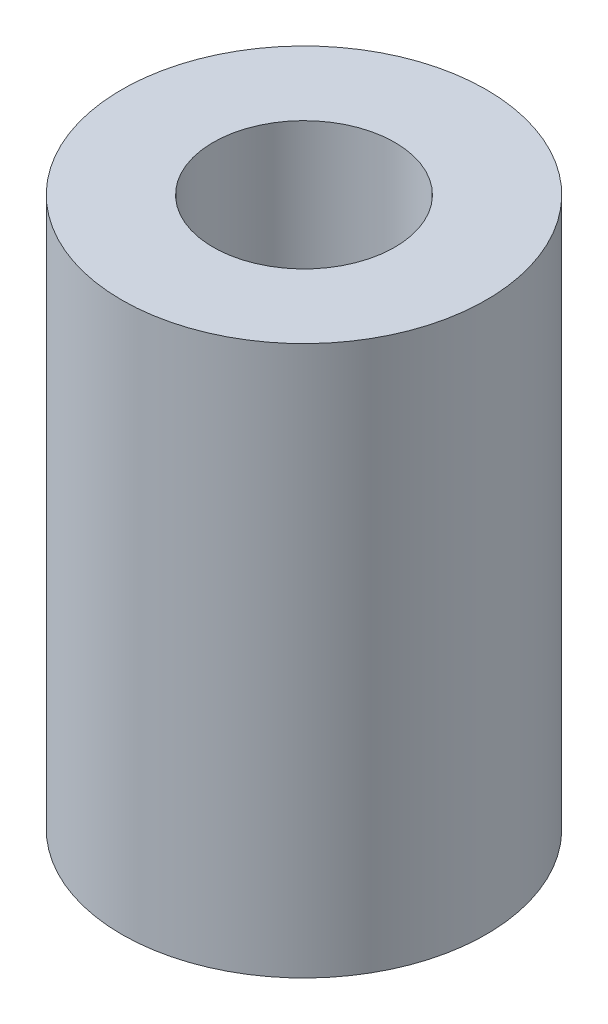
ISO-10303-21;
HEADER;
FILE_DESCRIPTION(('STEP AP214'),'2;1');
FILE_NAME('part.step','',(''),(''),'','','');
FILE_SCHEMA(('AUTOMOTIVE_DESIGN { 1 0 10303 214 1 1 1 1 }'));
ENDSEC;
DATA;
#1=APPLICATION_CONTEXT('core data for automotive mechanical design processes');
#2=APPLICATION_PROTOCOL_DEFINITION('international standard','automotive_design',2000,#1);
#3=PRODUCT_CONTEXT('',#1,'mechanical');
#4=PRODUCT('Part','Part','',(#3));
#5=PRODUCT_RELATED_PRODUCT_CATEGORY('part','',(#4));
#6=PRODUCT_DEFINITION_FORMATION('','',#4);
#7=PRODUCT_DEFINITION_CONTEXT('part definition',#1,'design');
#8=PRODUCT_DEFINITION('design','',#6,#7);
#9=PRODUCT_DEFINITION_SHAPE('','',#8);
#10=(LENGTH_UNIT() NAMED_UNIT(*) SI_UNIT(.MILLI.,.METRE.));
#11=(NAMED_UNIT(*) PLANE_ANGLE_UNIT() SI_UNIT($,.RADIAN.));
#12=(NAMED_UNIT(*) SI_UNIT($,.STERADIAN.) SOLID_ANGLE_UNIT());
#13=UNCERTAINTY_MEASURE_WITH_UNIT(LENGTH_MEASURE(1.E-05),#10,'distance_accuracy_value','');
#14=(GEOMETRIC_REPRESENTATION_CONTEXT(3) GLOBAL_UNCERTAINTY_ASSIGNED_CONTEXT((#13)) GLOBAL_UNIT_ASSIGNED_CONTEXT((#10,
#11,#12)) REPRESENTATION_CONTEXT('',''));
#15=CARTESIAN_POINT('',(0.,0.,0.));
#16=DIRECTION('',(0.,0.,1.));
#17=DIRECTION('',(1.,0.,0.));
#18=AXIS2_PLACEMENT_3D('',#15,#16,#17);
#19=CARTESIAN_POINT('',(0.,19.05,0.));
#20=DIRECTION('',(0.,-1.,0.));
#21=DIRECTION('',(0.,0.,-1.));
#22=AXIS2_PLACEMENT_3D('',#19,#20,#21);
#23=CYLINDRICAL_SURFACE('',#22,3.15);
#24=CARTESIAN_POINT('',(0.,19.05,0.));
#25=DIRECTION('',(0.,1.,0.));
#26=DIRECTION('',(0.,0.,1.));
#27=AXIS2_PLACEMENT_3D('',#24,#25,#26);
#28=CIRCLE('',#27,3.15);
#29=CARTESIAN_POINT('',(0.,19.05,-3.15));
#30=VERTEX_POINT('',#29);
#31=EDGE_CURVE('E38',#30,#30,#28,.T.);
#32=CARTESIAN_POINT('',(0.,0.,0.));
#33=DIRECTION('',(0.,1.,0.));
#34=DIRECTION('',(0.,0.,1.));
#35=AXIS2_PLACEMENT_3D('',#32,#33,#34);
#36=CIRCLE('',#35,3.15);
#37=CARTESIAN_POINT('',(0.,0.,-3.15));
#38=VERTEX_POINT('',#37);
#39=EDGE_CURVE('E44',#38,#38,#36,.T.);
#40=CARTESIAN_POINT('',(0.,19.05,-3.15));
#41=CARTESIAN_POINT('',(0.,18.8515625,-3.15));
#42=CARTESIAN_POINT('',(0.,18.653125,-3.15));
#43=CARTESIAN_POINT('',(0.,18.25625,-3.15));
#44=CARTESIAN_POINT('',(0.,18.0578125,-3.15));
#45=CARTESIAN_POINT('',(0.,17.6609375,-3.15));
#46=CARTESIAN_POINT('',(0.,17.4625,-3.15));
#47=CARTESIAN_POINT('',(0.,17.065625,-3.15));
#48=CARTESIAN_POINT('',(0.,16.8671875,-3.15));
#49=CARTESIAN_POINT('',(0.,16.4703125,-3.15));
#50=CARTESIAN_POINT('',(0.,16.271875,-3.15));
#51=CARTESIAN_POINT('',(0.,15.875,-3.15));
#52=CARTESIAN_POINT('',(0.,15.6765625,-3.15));
#53=CARTESIAN_POINT('',(0.,15.2796875,-3.15));
#54=CARTESIAN_POINT('',(0.,15.08125,-3.15));
#55=CARTESIAN_POINT('',(0.,14.684375,-3.15));
#56=CARTESIAN_POINT('',(0.,14.4859375,-3.15));
#57=CARTESIAN_POINT('',(0.,14.0890625,-3.15));
#58=CARTESIAN_POINT('',(0.,13.890625,-3.15));
#59=CARTESIAN_POINT('',(0.,13.49375,-3.15));
#60=CARTESIAN_POINT('',(0.,13.2953125,-3.15));
#61=CARTESIAN_POINT('',(0.,12.8984375,-3.15));
#62=CARTESIAN_POINT('',(0.,12.7,-3.15));
#63=CARTESIAN_POINT('',(0.,12.303125,-3.15));
#64=CARTESIAN_POINT('',(0.,12.1046875,-3.15));
#65=CARTESIAN_POINT('',(0.,11.7078125,-3.15));
#66=CARTESIAN_POINT('',(0.,11.509375,-3.15));
#67=CARTESIAN_POINT('',(0.,11.1125,-3.15));
#68=CARTESIAN_POINT('',(0.,10.9140625,-3.15));
#69=CARTESIAN_POINT('',(0.,10.5171875,-3.15));
#70=CARTESIAN_POINT('',(0.,10.31875,-3.15));
#71=CARTESIAN_POINT('',(0.,9.921875,-3.15));
#72=CARTESIAN_POINT('',(0.,9.7234375,-3.15));
#73=CARTESIAN_POINT('',(0.,9.3265625,-3.15));
#74=CARTESIAN_POINT('',(0.,9.128125,-3.15));
#75=CARTESIAN_POINT('',(0.,8.73125,-3.15));
#76=CARTESIAN_POINT('',(0.,8.5328125,-3.15));
#77=CARTESIAN_POINT('',(0.,8.1359375,-3.15));
#78=CARTESIAN_POINT('',(0.,7.9375,-3.15));
#79=CARTESIAN_POINT('',(0.,7.540625,-3.15));
#80=CARTESIAN_POINT('',(0.,7.3421875,-3.15));
#81=CARTESIAN_POINT('',(0.,6.9453125,-3.15));
#82=CARTESIAN_POINT('',(0.,6.746875,-3.15));
#83=CARTESIAN_POINT('',(0.,6.35,-3.15));
#84=CARTESIAN_POINT('',(0.,6.1515625,-3.15));
#85=CARTESIAN_POINT('',(0.,5.7546875,-3.15));
#86=CARTESIAN_POINT('',(0.,5.55625,-3.15));
#87=CARTESIAN_POINT('',(0.,5.159375,-3.15));
#88=CARTESIAN_POINT('',(0.,4.9609375,-3.15));
#89=CARTESIAN_POINT('',(0.,4.5640625,-3.15));
#90=CARTESIAN_POINT('',(0.,4.365625,-3.15));
#91=CARTESIAN_POINT('',(0.,3.96875,-3.15));
#92=CARTESIAN_POINT('',(0.,3.7703125,-3.15));
#93=CARTESIAN_POINT('',(0.,3.3734375,-3.15));
#94=CARTESIAN_POINT('',(0.,3.175,-3.15));
#95=CARTESIAN_POINT('',(0.,2.778125,-3.15));
#96=CARTESIAN_POINT('',(0.,2.5796875,-3.15));
#97=CARTESIAN_POINT('',(0.,2.1828125,-3.15));
#98=CARTESIAN_POINT('',(0.,1.984375,-3.15));
#99=CARTESIAN_POINT('',(0.,1.5875,-3.15));
#100=CARTESIAN_POINT('',(0.,1.3890625,-3.15));
#101=CARTESIAN_POINT('',(0.,0.992187500000001,-3.15));
#102=CARTESIAN_POINT('',(0.,0.793750000000001,-3.15));
#103=CARTESIAN_POINT('',(0.,0.396875,-3.15));
#104=CARTESIAN_POINT('',(0.,0.1984375,-3.15));
#105=CARTESIAN_POINT('',(0.,0.,-3.15));
#106=B_SPLINE_CURVE_WITH_KNOTS('',3,(#40,#41,#42,#43,#44,#45,#46,#47,#48,#49,#50,#51,#52,#53,
#54,#55,#56,#57,#58,#59,#60,#61,#62,#63,#64,#65,#66,#67,#68,#69,#70,#71,#72,#73,#74,#75,#76,#77,
#78,#79,#80,#81,#82,#83,#84,#85,#86,#87,#88,#89,#90,#91,#92,#93,#94,#95,#96,#97,#98,#99,#100,
#101,#102,#103,#104,#105),.UNSPECIFIED.,.F.,.F.,(4,2,2,2,2,2,2,2,2,2,2,2,2,2,2,2,2,2,2,2,2,2,2,
2,2,2,2,2,2,2,2,2,4),(0.,0.5953125,1.190625,1.7859375,2.38125,2.9765625,3.571875,4.1671875,
4.7625,5.3578125,5.953125,6.5484375,7.14375,7.7390625,8.334375,8.9296875,9.525,10.1203125,
10.715625,11.3109375,11.90625,12.5015625,13.096875,13.6921875,14.2875,14.8828125,15.478125,
16.0734375,16.66875,17.2640625,17.859375,18.4546875,19.05),.UNSPECIFIED.);
#107=EDGE_CURVE('BSEAM31',#30,#38,#106,.T.);
#108=ORIENTED_EDGE('',*,*,#31,.T.);
#109=ORIENTED_EDGE('',*,*,#39,.F.);
#110=ORIENTED_EDGE('',*,*,#107,.T.);
#111=ORIENTED_EDGE('',*,*,#107,.F.);
#112=EDGE_LOOP('',(#108,#110,#109,#111));
#113=FACE_BOUND('',#112,.T.);
#114=ADVANCED_FACE('F31',(#113),#23,.F.);
#115=CARTESIAN_POINT('',(0.,19.05,0.));
#116=DIRECTION('',(0.,-1.,0.));
#117=DIRECTION('',(0.,0.,-1.));
#118=AXIS2_PLACEMENT_3D('',#115,#116,#117);
#119=CYLINDRICAL_SURFACE('',#118,6.32);
#120=CARTESIAN_POINT('',(0.,19.05,0.));
#121=DIRECTION('',(0.,1.,0.));
#122=DIRECTION('',(0.,0.,1.));
#123=AXIS2_PLACEMENT_3D('',#120,#121,#122);
#124=CIRCLE('',#123,6.32);
#125=CARTESIAN_POINT('',(0.,19.05,-6.32));
#126=VERTEX_POINT('',#125);
#127=EDGE_CURVE('E10',#126,#126,#124,.T.);
#128=CARTESIAN_POINT('',(0.,0.,0.));
#129=DIRECTION('',(0.,1.,0.));
#130=DIRECTION('',(0.,0.,1.));
#131=AXIS2_PLACEMENT_3D('',#128,#129,#130);
#132=CIRCLE('',#131,6.32);
#133=CARTESIAN_POINT('',(0.,0.,-6.32));
#134=VERTEX_POINT('',#133);
#135=EDGE_CURVE('E34',#134,#134,#132,.T.);
#136=CARTESIAN_POINT('',(0.,19.05,-6.32));
#137=CARTESIAN_POINT('',(0.,18.8515625,-6.32));
#138=CARTESIAN_POINT('',(0.,18.653125,-6.32));
#139=CARTESIAN_POINT('',(0.,18.25625,-6.32));
#140=CARTESIAN_POINT('',(0.,18.0578125,-6.32));
#141=CARTESIAN_POINT('',(0.,17.6609375,-6.32));
#142=CARTESIAN_POINT('',(0.,17.4625,-6.32));
#143=CARTESIAN_POINT('',(0.,17.065625,-6.32));
#144=CARTESIAN_POINT('',(0.,16.8671875,-6.32));
#145=CARTESIAN_POINT('',(0.,16.4703125,-6.32));
#146=CARTESIAN_POINT('',(0.,16.271875,-6.32));
#147=CARTESIAN_POINT('',(0.,15.875,-6.32));
#148=CARTESIAN_POINT('',(0.,15.6765625,-6.32));
#149=CARTESIAN_POINT('',(0.,15.2796875,-6.32));
#150=CARTESIAN_POINT('',(0.,15.08125,-6.32));
#151=CARTESIAN_POINT('',(0.,14.684375,-6.32));
#152=CARTESIAN_POINT('',(0.,14.4859375,-6.32));
#153=CARTESIAN_POINT('',(0.,14.0890625,-6.32));
#154=CARTESIAN_POINT('',(0.,13.890625,-6.32));
#155=CARTESIAN_POINT('',(0.,13.49375,-6.32));
#156=CARTESIAN_POINT('',(0.,13.2953125,-6.32));
#157=CARTESIAN_POINT('',(0.,12.8984375,-6.32));
#158=CARTESIAN_POINT('',(0.,12.7,-6.32));
#159=CARTESIAN_POINT('',(0.,12.303125,-6.32));
#160=CARTESIAN_POINT('',(0.,12.1046875,-6.32));
#161=CARTESIAN_POINT('',(0.,11.7078125,-6.32));
#162=CARTESIAN_POINT('',(0.,11.509375,-6.32));
#163=CARTESIAN_POINT('',(0.,11.1125,-6.32));
#164=CARTESIAN_POINT('',(0.,10.9140625,-6.32));
#165=CARTESIAN_POINT('',(0.,10.5171875,-6.32));
#166=CARTESIAN_POINT('',(0.,10.31875,-6.32));
#167=CARTESIAN_POINT('',(0.,9.921875,-6.32));
#168=CARTESIAN_POINT('',(0.,9.7234375,-6.32));
#169=CARTESIAN_POINT('',(0.,9.3265625,-6.32));
#170=CARTESIAN_POINT('',(0.,9.128125,-6.32));
#171=CARTESIAN_POINT('',(0.,8.73125,-6.32));
#172=CARTESIAN_POINT('',(0.,8.5328125,-6.32));
#173=CARTESIAN_POINT('',(0.,8.1359375,-6.32));
#174=CARTESIAN_POINT('',(0.,7.9375,-6.32));
#175=CARTESIAN_POINT('',(0.,7.540625,-6.32));
#176=CARTESIAN_POINT('',(0.,7.3421875,-6.32));
#177=CARTESIAN_POINT('',(0.,6.9453125,-6.32));
#178=CARTESIAN_POINT('',(0.,6.746875,-6.32));
#179=CARTESIAN_POINT('',(0.,6.35,-6.32));
#180=CARTESIAN_POINT('',(0.,6.1515625,-6.32));
#181=CARTESIAN_POINT('',(0.,5.7546875,-6.32));
#182=CARTESIAN_POINT('',(0.,5.55625,-6.32));
#183=CARTESIAN_POINT('',(0.,5.159375,-6.32));
#184=CARTESIAN_POINT('',(0.,4.9609375,-6.32));
#185=CARTESIAN_POINT('',(0.,4.5640625,-6.32));
#186=CARTESIAN_POINT('',(0.,4.365625,-6.32));
#187=CARTESIAN_POINT('',(0.,3.96875,-6.32));
#188=CARTESIAN_POINT('',(0.,3.7703125,-6.32));
#189=CARTESIAN_POINT('',(0.,3.3734375,-6.32));
#190=CARTESIAN_POINT('',(0.,3.175,-6.32));
#191=CARTESIAN_POINT('',(0.,2.778125,-6.32));
#192=CARTESIAN_POINT('',(0.,2.5796875,-6.32));
#193=CARTESIAN_POINT('',(0.,2.1828125,-6.32));
#194=CARTESIAN_POINT('',(0.,1.984375,-6.32));
#195=CARTESIAN_POINT('',(0.,1.5875,-6.32));
#196=CARTESIAN_POINT('',(0.,1.3890625,-6.32));
#197=CARTESIAN_POINT('',(0.,0.992187500000001,-6.32));
#198=CARTESIAN_POINT('',(0.,0.793750000000001,-6.32));
#199=CARTESIAN_POINT('',(0.,0.396875,-6.32));
#200=CARTESIAN_POINT('',(0.,0.1984375,-6.32));
#201=CARTESIAN_POINT('',(0.,0.,-6.32));
#202=B_SPLINE_CURVE_WITH_KNOTS('',3,(#136,#137,#138,#139,#140,#141,#142,#143,#144,#145,#146,
#147,#148,#149,#150,#151,#152,#153,#154,#155,#156,#157,#158,#159,#160,#161,#162,#163,#164,#165,
#166,#167,#168,#169,#170,#171,#172,#173,#174,#175,#176,#177,#178,#179,#180,#181,#182,#183,#184,
#185,#186,#187,#188,#189,#190,#191,#192,#193,#194,#195,#196,#197,#198,#199,#200,#201),
.UNSPECIFIED.,.F.,.F.,(4,2,2,2,2,2,2,2,2,2,2,2,2,2,2,2,2,2,2,2,2,2,2,2,2,2,2,2,2,2,2,2,4),(0.,
0.595312499999997,1.190625,1.7859375,2.38125,2.9765625,3.571875,4.1671875,4.7625,5.3578125,
5.953125,6.5484375,7.14375,7.7390625,8.334375,8.9296875,9.525,10.1203125,10.715625,11.3109375,
11.90625,12.5015625,13.096875,13.6921875,14.2875,14.8828125,15.478125,16.0734375,16.66875,
17.2640625,17.859375,18.4546875,19.05),.UNSPECIFIED.);
#203=EDGE_CURVE('BSEAM51',#126,#134,#202,.T.);
#204=ORIENTED_EDGE('',*,*,#127,.F.);
#205=ORIENTED_EDGE('',*,*,#135,.T.);
#206=ORIENTED_EDGE('',*,*,#203,.T.);
#207=ORIENTED_EDGE('',*,*,#203,.F.);
#208=EDGE_LOOP('',(#204,#206,#205,#207));
#209=FACE_BOUND('',#208,.T.);
#210=ADVANCED_FACE('F51',(#209),#119,.T.);
#211=CARTESIAN_POINT('',(0.,19.05,0.));
#212=DIRECTION('',(0.,1.,0.));
#213=DIRECTION('',(0.,0.,1.));
#214=AXIS2_PLACEMENT_3D('',#211,#212,#213);
#215=PLANE('',#214);
#216=ORIENTED_EDGE('',*,*,#31,.F.);
#217=EDGE_LOOP('',(#216));
#218=FACE_BOUND('',#217,.T.);
#219=ORIENTED_EDGE('',*,*,#127,.T.);
#220=EDGE_LOOP('',(#219));
#221=FACE_BOUND('',#220,.T.);
#222=ADVANCED_FACE('F55',(#218,#221),#215,.T.);
#223=CARTESIAN_POINT('',(0.,0.,0.));
#224=DIRECTION('',(0.,1.,0.));
#225=DIRECTION('',(0.,0.,1.));
#226=AXIS2_PLACEMENT_3D('',#223,#224,#225);
#227=PLANE('',#226);
#228=ORIENTED_EDGE('',*,*,#39,.T.);
#229=EDGE_LOOP('',(#228));
#230=FACE_BOUND('',#229,.T.);
#231=ORIENTED_EDGE('',*,*,#135,.F.);
#232=EDGE_LOOP('',(#231));
#233=FACE_BOUND('',#232,.T.);
#234=ADVANCED_FACE('F53',(#230,#233),#227,.F.);
#235=CLOSED_SHELL('',(#114,#210,#222,#234));
#236=MANIFOLD_SOLID_BREP('B2',#235);
#237=ADVANCED_BREP_SHAPE_REPRESENTATION('',(#18,#236),#14);
#238=SHAPE_DEFINITION_REPRESENTATION(#9,#237);
ENDSEC;
END-ISO-10303-21;
